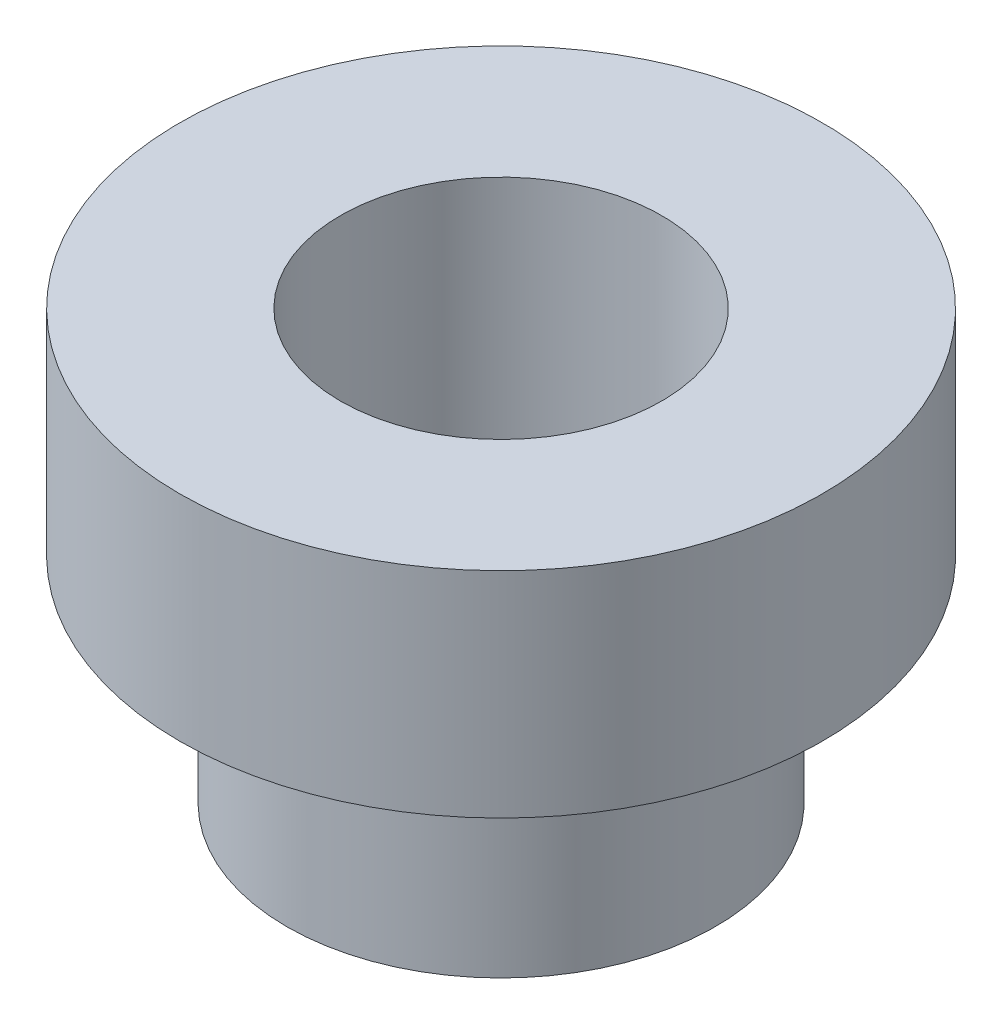
ISO-10303-21;
HEADER;
FILE_DESCRIPTION(('STEP AP214'),'2;1');
FILE_NAME('part.step','',(''),(''),'','','');
FILE_SCHEMA(('AUTOMOTIVE_DESIGN { 1 0 10303 214 1 1 1 1 }'));
ENDSEC;
DATA;
#1=APPLICATION_CONTEXT('core data for automotive mechanical design processes');
#2=APPLICATION_PROTOCOL_DEFINITION('international standard','automotive_design',2000,#1);
#3=PRODUCT_CONTEXT('',#1,'mechanical');
#4=PRODUCT('Part','Part','',(#3));
#5=PRODUCT_RELATED_PRODUCT_CATEGORY('part','',(#4));
#6=PRODUCT_DEFINITION_FORMATION('','',#4);
#7=PRODUCT_DEFINITION_CONTEXT('part definition',#1,'design');
#8=PRODUCT_DEFINITION('design','',#6,#7);
#9=PRODUCT_DEFINITION_SHAPE('','',#8);
#10=(LENGTH_UNIT() NAMED_UNIT(*) SI_UNIT(.MILLI.,.METRE.));
#11=(NAMED_UNIT(*) PLANE_ANGLE_UNIT() SI_UNIT($,.RADIAN.));
#12=(NAMED_UNIT(*) SI_UNIT($,.STERADIAN.) SOLID_ANGLE_UNIT());
#13=UNCERTAINTY_MEASURE_WITH_UNIT(LENGTH_MEASURE(1.E-05),#10,'distance_accuracy_value','');
#14=(GEOMETRIC_REPRESENTATION_CONTEXT(3) GLOBAL_UNCERTAINTY_ASSIGNED_CONTEXT((#13)) GLOBAL_UNIT_ASSIGNED_CONTEXT((#10,
#11,#12)) REPRESENTATION_CONTEXT('',''));
#15=CARTESIAN_POINT('',(0.,0.,0.));
#16=DIRECTION('',(0.,0.,1.));
#17=DIRECTION('',(1.,0.,0.));
#18=AXIS2_PLACEMENT_3D('',#15,#16,#17);
#19=CARTESIAN_POINT('',(0.,0.,0.));
#20=DIRECTION('',(0.,1.,0.));
#21=DIRECTION('',(0.,0.,1.));
#22=AXIS2_PLACEMENT_3D('',#19,#20,#21);
#23=PLANE('',#22);
#24=CARTESIAN_POINT('',(0.,0.,0.));
#25=DIRECTION('',(0.,1.,0.));
#26=DIRECTION('',(0.,0.,1.));
#27=AXIS2_PLACEMENT_3D('',#24,#25,#26);
#28=CIRCLE('',#27,2.);
#29=CARTESIAN_POINT('',(0.,0.,2.));
#30=VERTEX_POINT('',#29);
#31=EDGE_CURVE('E35',#30,#30,#28,.T.);
#32=ORIENTED_EDGE('',*,*,#31,.F.);
#33=EDGE_LOOP('',(#32));
#34=FACE_BOUND('',#33,.T.);
#35=CARTESIAN_POINT('',(0.,0.,0.));
#36=DIRECTION('',(0.,1.,0.));
#37=DIRECTION('',(0.,0.,1.));
#38=AXIS2_PLACEMENT_3D('',#35,#36,#37);
#39=CIRCLE('',#38,1.5);
#40=CARTESIAN_POINT('',(0.,0.,1.5));
#41=VERTEX_POINT('',#40);
#42=EDGE_CURVE('E42',#41,#41,#39,.T.);
#43=ORIENTED_EDGE('',*,*,#42,.T.);
#44=EDGE_LOOP('',(#43));
#45=FACE_BOUND('',#44,.T.);
#46=ADVANCED_FACE('F31',(#34,#45),#23,.F.);
#47=CARTESIAN_POINT('',(0.,2.,0.));
#48=DIRECTION('',(0.,-1.,0.));
#49=DIRECTION('',(0.,0.,-1.));
#50=AXIS2_PLACEMENT_3D('',#47,#48,#49);
#51=CYLINDRICAL_SURFACE('',#50,2.);
#52=CARTESIAN_POINT('',(0.,2.,0.));
#53=DIRECTION('',(0.,1.,0.));
#54=DIRECTION('',(0.,0.,1.));
#55=AXIS2_PLACEMENT_3D('',#52,#53,#54);
#56=CIRCLE('',#55,2.);
#57=CARTESIAN_POINT('',(0.,2.,2.));
#58=VERTEX_POINT('',#57);
#59=EDGE_CURVE('E10',#58,#58,#56,.T.);
#60=ORIENTED_EDGE('',*,*,#59,.F.);
#61=EDGE_LOOP('',(#60));
#62=FACE_BOUND('',#61,.T.);
#63=ORIENTED_EDGE('',*,*,#31,.T.);
#64=EDGE_LOOP('',(#63));
#65=FACE_BOUND('',#64,.T.);
#66=ADVANCED_FACE('F33',(#62,#65),#51,.T.);
#67=CARTESIAN_POINT('',(0.,2.,0.));
#68=DIRECTION('',(0.,-1.,0.));
#69=DIRECTION('',(0.,0.,-1.));
#70=AXIS2_PLACEMENT_3D('',#67,#68,#69);
#71=CYLINDRICAL_SURFACE('',#70,1.5);
#72=ORIENTED_EDGE('',*,*,#42,.F.);
#73=EDGE_LOOP('',(#72));
#74=FACE_BOUND('',#73,.T.);
#75=CARTESIAN_POINT('',(0.,4.,0.));
#76=DIRECTION('',(0.,1.,0.));
#77=DIRECTION('',(0.,0.,1.));
#78=AXIS2_PLACEMENT_3D('',#75,#76,#77);
#79=CIRCLE('',#78,1.5);
#80=CARTESIAN_POINT('',(0.,4.,1.5));
#81=VERTEX_POINT('',#80);
#82=EDGE_CURVE('E50',#81,#81,#79,.T.);
#83=ORIENTED_EDGE('',*,*,#82,.T.);
#84=EDGE_LOOP('',(#83));
#85=FACE_BOUND('',#84,.T.);
#86=ADVANCED_FACE('F56',(#74,#85),#71,.F.);
#87=CARTESIAN_POINT('',(0.,4.,0.));
#88=DIRECTION('',(0.,1.,0.));
#89=DIRECTION('',(0.,0.,1.));
#90=AXIS2_PLACEMENT_3D('',#87,#88,#89);
#91=PLANE('',#90);
#92=CARTESIAN_POINT('',(0.,4.,0.));
#93=DIRECTION('',(0.,1.,0.));
#94=DIRECTION('',(0.,0.,1.));
#95=AXIS2_PLACEMENT_3D('',#92,#93,#94);
#96=CIRCLE('',#95,3.);
#97=CARTESIAN_POINT('',(0.,4.,3.));
#98=VERTEX_POINT('',#97);
#99=EDGE_CURVE('E46',#98,#98,#96,.T.);
#100=ORIENTED_EDGE('',*,*,#99,.T.);
#101=EDGE_LOOP('',(#100));
#102=FACE_BOUND('',#101,.T.);
#103=ORIENTED_EDGE('',*,*,#82,.F.);
#104=EDGE_LOOP('',(#103));
#105=FACE_BOUND('',#104,.T.);
#106=ADVANCED_FACE('F58',(#102,#105),#91,.T.);
#107=CARTESIAN_POINT('',(0.,2.,0.));
#108=DIRECTION('',(0.,1.,0.));
#109=DIRECTION('',(0.,0.,1.));
#110=AXIS2_PLACEMENT_3D('',#107,#108,#109);
#111=PLANE('',#110);
#112=ORIENTED_EDGE('',*,*,#59,.T.);
#113=EDGE_LOOP('',(#112));
#114=FACE_BOUND('',#113,.T.);
#115=CARTESIAN_POINT('',(0.,2.,0.));
#116=DIRECTION('',(0.,1.,0.));
#117=DIRECTION('',(0.,0.,1.));
#118=AXIS2_PLACEMENT_3D('',#115,#116,#117);
#119=CIRCLE('',#118,3.);
#120=CARTESIAN_POINT('',(0.,2.,3.));
#121=VERTEX_POINT('',#120);
#122=EDGE_CURVE('E47',#121,#121,#119,.T.);
#123=ORIENTED_EDGE('',*,*,#122,.F.);
#124=EDGE_LOOP('',(#123));
#125=FACE_BOUND('',#124,.T.);
#126=ADVANCED_FACE('F60',(#114,#125),#111,.F.);
#127=CARTESIAN_POINT('',(0.,4.,0.));
#128=DIRECTION('',(0.,-1.,0.));
#129=DIRECTION('',(0.,0.,-1.));
#130=AXIS2_PLACEMENT_3D('',#127,#128,#129);
#131=CYLINDRICAL_SURFACE('',#130,3.);
#132=ORIENTED_EDGE('',*,*,#99,.F.);
#133=EDGE_LOOP('',(#132));
#134=FACE_BOUND('',#133,.T.);
#135=ORIENTED_EDGE('',*,*,#122,.T.);
#136=EDGE_LOOP('',(#135));
#137=FACE_BOUND('',#136,.T.);
#138=ADVANCED_FACE('F67',(#134,#137),#131,.T.);
#139=CLOSED_SHELL('',(#46,#66,#86,#106,#126,#138));
#140=MANIFOLD_SOLID_BREP('B2',#139);
#141=ADVANCED_BREP_SHAPE_REPRESENTATION('',(#18,#140),#14);
#142=SHAPE_DEFINITION_REPRESENTATION(#9,#141);
ENDSEC;
END-ISO-10303-21;
